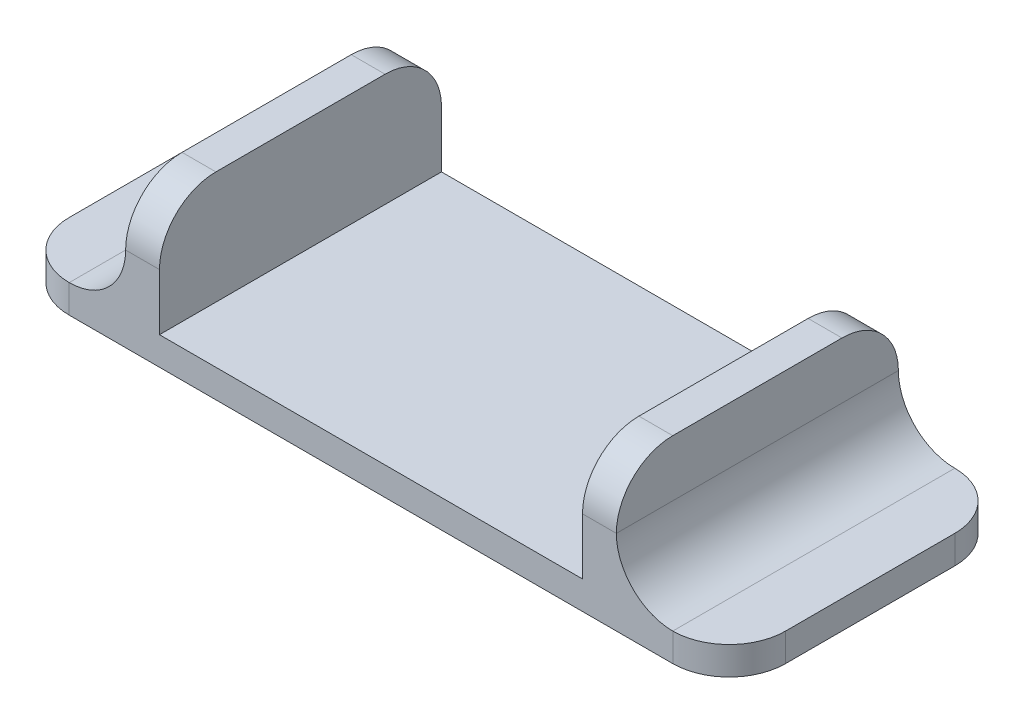
ISO-10303-21;
HEADER;
FILE_DESCRIPTION(('STEP AP214'),'2;1');
FILE_NAME('part.step','',(''),(''),'','','');
FILE_SCHEMA(('AUTOMOTIVE_DESIGN { 1 0 10303 214 1 1 1 1 }'));
ENDSEC;
DATA;
#1=APPLICATION_CONTEXT('core data for automotive mechanical design processes');
#2=APPLICATION_PROTOCOL_DEFINITION('international standard','automotive_design',2000,#1);
#3=PRODUCT_CONTEXT('',#1,'mechanical');
#4=PRODUCT('Part','Part','',(#3));
#5=PRODUCT_RELATED_PRODUCT_CATEGORY('part','',(#4));
#6=PRODUCT_DEFINITION_FORMATION('','',#4);
#7=PRODUCT_DEFINITION_CONTEXT('part definition',#1,'design');
#8=PRODUCT_DEFINITION('design','',#6,#7);
#9=PRODUCT_DEFINITION_SHAPE('','',#8);
#10=(LENGTH_UNIT() NAMED_UNIT(*) SI_UNIT(.MILLI.,.METRE.));
#11=(NAMED_UNIT(*) PLANE_ANGLE_UNIT() SI_UNIT($,.RADIAN.));
#12=(NAMED_UNIT(*) SI_UNIT($,.STERADIAN.) SOLID_ANGLE_UNIT());
#13=UNCERTAINTY_MEASURE_WITH_UNIT(LENGTH_MEASURE(1.E-05),#10,'distance_accuracy_value','');
#14=(GEOMETRIC_REPRESENTATION_CONTEXT(3) GLOBAL_UNCERTAINTY_ASSIGNED_CONTEXT((#13)) GLOBAL_UNIT_ASSIGNED_CONTEXT((#10,
#11,#12)) REPRESENTATION_CONTEXT('',''));
#15=CARTESIAN_POINT('',(0.,0.,0.));
#16=DIRECTION('',(0.,0.,1.));
#17=DIRECTION('',(1.,0.,0.));
#18=AXIS2_PLACEMENT_3D('',#15,#16,#17);
#19=CARTESIAN_POINT('',(0.,0.,50.));
#20=DIRECTION('',(0.,-1.,0.));
#21=DIRECTION('',(0.,0.,-1.));
#22=AXIS2_PLACEMENT_3D('',#19,#20,#21);
#23=PLANE('',#22);
#24=DIRECTION('',(-1.,0.,0.));
#25=VECTOR('',#24,1.);
#26=CARTESIAN_POINT('',(0.,0.,50.));
#27=LINE('',#26,#25);
#28=CARTESIAN_POINT('',(-1.,0.,50.));
#29=VERTEX_POINT('',#28);
#30=CARTESIAN_POINT('',(-76.,0.,50.));
#31=VERTEX_POINT('',#30);
#32=EDGE_CURVE('E284',#29,#31,#27,.T.);
#33=ORIENTED_EDGE('',*,*,#32,.F.);
#34=DIRECTION('',(0.,0.,1.));
#35=VECTOR('',#34,1.);
#36=CARTESIAN_POINT('',(-1.,0.,0.));
#37=LINE('',#36,#35);
#38=CARTESIAN_POINT('',(-1.,0.,0.));
#39=VERTEX_POINT('',#38);
#40=EDGE_CURVE('E306',#39,#29,#37,.T.);
#41=ORIENTED_EDGE('',*,*,#40,.F.);
#42=DIRECTION('',(-1.,0.,0.));
#43=VECTOR('',#42,1.);
#44=CARTESIAN_POINT('',(0.,0.,0.));
#45=LINE('',#44,#43);
#46=CARTESIAN_POINT('',(-76.,0.,0.));
#47=VERTEX_POINT('',#46);
#48=EDGE_CURVE('E286',#39,#47,#45,.T.);
#49=ORIENTED_EDGE('',*,*,#48,.T.);
#50=DIRECTION('',(0.,0.,-1.));
#51=VECTOR('',#50,1.);
#52=CARTESIAN_POINT('',(-76.,0.,50.));
#53=LINE('',#52,#51);
#54=EDGE_CURVE('E314',#31,#47,#53,.T.);
#55=ORIENTED_EDGE('',*,*,#54,.F.);
#56=EDGE_LOOP('',(#33,#41,#49,#55));
#57=FACE_BOUND('',#56,.T.);
#58=ADVANCED_FACE('F33',(#57),#23,.F.);
#59=CARTESIAN_POINT('',(-82.,40.,50.));
#60=DIRECTION('',(1.,0.,0.));
#61=DIRECTION('',(0.,0.,-1.));
#62=AXIS2_PLACEMENT_3D('',#59,#60,#61);
#63=PLANE('',#62);
#64=DIRECTION('',(0.,0.,1.));
#65=VECTOR('',#64,1.);
#66=CARTESIAN_POINT('',(-82.,20.,-43.));
#67=LINE('',#66,#65);
#68=CARTESIAN_POINT('',(-82.,20.,9.99999999999999));
#69=VERTEX_POINT('',#68);
#70=CARTESIAN_POINT('',(-82.,20.,40.));
#71=VERTEX_POINT('',#70);
#72=EDGE_CURVE('E294',#69,#71,#67,.T.);
#73=ORIENTED_EDGE('',*,*,#72,.F.);
#74=CARTESIAN_POINT('',(-82.,10.,10.));
#75=DIRECTION('',(1.,0.,0.));
#76=DIRECTION('',(0.,0.,-1.));
#77=AXIS2_PLACEMENT_3D('',#74,#75,#76);
#78=CIRCLE('',#77,10.);
#79=CARTESIAN_POINT('',(-82.,10.,0.));
#80=VERTEX_POINT('',#79);
#81=EDGE_CURVE('E274',#69,#80,#78,.F.);
#82=ORIENTED_EDGE('',*,*,#81,.T.);
#83=DIRECTION('',(0.,0.,-1.));
#84=VECTOR('',#83,1.);
#85=CARTESIAN_POINT('',(-82.,10.,50.));
#86=LINE('',#85,#84);
#87=CARTESIAN_POINT('',(-82.,10.,50.));
#88=VERTEX_POINT('',#87);
#89=EDGE_CURVE('E229',#80,#88,#86,.F.);
#90=ORIENTED_EDGE('',*,*,#89,.T.);
#91=CARTESIAN_POINT('',(-82.,10.,40.));
#92=DIRECTION('',(1.,0.,0.));
#93=DIRECTION('',(0.,0.,-1.));
#94=AXIS2_PLACEMENT_3D('',#91,#92,#93);
#95=CIRCLE('',#94,10.);
#96=EDGE_CURVE('E272',#88,#71,#95,.F.);
#97=ORIENTED_EDGE('',*,*,#96,.T.);
#98=EDGE_LOOP('',(#73,#82,#90,#97));
#99=FACE_BOUND('',#98,.T.);
#100=ADVANCED_FACE('F293',(#99),#63,.F.);
#101=CARTESIAN_POINT('',(-82.,0.,50.));
#102=DIRECTION('',(0.,-1.,0.));
#103=DIRECTION('',(0.,0.,-1.));
#104=AXIS2_PLACEMENT_3D('',#101,#102,#103);
#105=PLANE('',#104);
#106=DIRECTION('',(0.,0.,-1.));
#107=VECTOR('',#106,1.);
#108=CARTESIAN_POINT('',(-92.,0.,0.));
#109=LINE('',#108,#107);
#110=CARTESIAN_POINT('',(-92.,0.,50.));
#111=VERTEX_POINT('',#110);
#112=CARTESIAN_POINT('',(-92.,0.,0.));
#113=VERTEX_POINT('',#112);
#114=EDGE_CURVE('E218',#111,#113,#109,.T.);
#115=ORIENTED_EDGE('',*,*,#114,.T.);
#116=CARTESIAN_POINT('',(-92.,0.,10.));
#117=DIRECTION('',(0.,-1.,0.));
#118=DIRECTION('',(0.,0.,-1.));
#119=AXIS2_PLACEMENT_3D('',#116,#117,#118);
#120=CIRCLE('',#119,10.);
#121=CARTESIAN_POINT('',(-102.,0.,10.));
#122=VERTEX_POINT('',#121);
#123=EDGE_CURVE('E224',#113,#122,#120,.F.);
#124=ORIENTED_EDGE('',*,*,#123,.T.);
#125=DIRECTION('',(0.,0.,-1.));
#126=VECTOR('',#125,1.);
#127=CARTESIAN_POINT('',(-102.,0.,50.));
#128=LINE('',#127,#126);
#129=CARTESIAN_POINT('',(-102.,0.,40.));
#130=VERTEX_POINT('',#129);
#131=EDGE_CURVE('E186',#130,#122,#128,.T.);
#132=ORIENTED_EDGE('',*,*,#131,.F.);
#133=CARTESIAN_POINT('',(-92.,0.,40.));
#134=DIRECTION('',(0.,-1.,0.));
#135=DIRECTION('',(0.,0.,-1.));
#136=AXIS2_PLACEMENT_3D('',#133,#134,#135);
#137=CIRCLE('',#136,10.);
#138=EDGE_CURVE('E221',#130,#111,#137,.F.);
#139=ORIENTED_EDGE('',*,*,#138,.T.);
#140=EDGE_LOOP('',(#115,#124,#132,#139));
#141=FACE_BOUND('',#140,.T.);
#142=ADVANCED_FACE('F341',(#141),#105,.F.);
#143=CARTESIAN_POINT('',(-102.,-5.,50.));
#144=DIRECTION('',(1.,0.,0.));
#145=DIRECTION('',(0.,0.,-1.));
#146=AXIS2_PLACEMENT_3D('',#143,#144,#145);
#147=PLANE('',#146);
#148=ORIENTED_EDGE('',*,*,#131,.T.);
#149=DIRECTION('',(0.,-1.,0.));
#150=VECTOR('',#149,1.);
#151=CARTESIAN_POINT('',(-102.,-5.,10.));
#152=LINE('',#151,#150);
#153=CARTESIAN_POINT('',(-102.,-5.,10.));
#154=VERTEX_POINT('',#153);
#155=EDGE_CURVE('E215',#122,#154,#152,.T.);
#156=ORIENTED_EDGE('',*,*,#155,.T.);
#157=DIRECTION('',(0.,0.,-1.));
#158=VECTOR('',#157,1.);
#159=CARTESIAN_POINT('',(-102.,-5.,50.));
#160=LINE('',#159,#158);
#161=CARTESIAN_POINT('',(-102.,-5.,40.));
#162=VERTEX_POINT('',#161);
#163=EDGE_CURVE('E190',#162,#154,#160,.T.);
#164=ORIENTED_EDGE('',*,*,#163,.F.);
#165=DIRECTION('',(0.,-1.,0.));
#166=VECTOR('',#165,1.);
#167=CARTESIAN_POINT('',(-102.,-5.,40.));
#168=LINE('',#167,#166);
#169=EDGE_CURVE('E213',#162,#130,#168,.F.);
#170=ORIENTED_EDGE('',*,*,#169,.T.);
#171=EDGE_LOOP('',(#148,#156,#164,#170));
#172=FACE_BOUND('',#171,.T.);
#173=ADVANCED_FACE('F332',(#172),#147,.F.);
#174=CARTESIAN_POINT('',(25.,-5.,50.));
#175=DIRECTION('',(0.,1.,0.));
#176=DIRECTION('',(0.,0.,1.));
#177=AXIS2_PLACEMENT_3D('',#174,#175,#176);
#178=PLANE('',#177);
#179=DIRECTION('',(1.,0.,0.));
#180=VECTOR('',#179,1.);
#181=CARTESIAN_POINT('',(25.,-5.,0.));
#182=LINE('',#181,#180);
#183=CARTESIAN_POINT('',(-92.,-5.,0.));
#184=VERTEX_POINT('',#183);
#185=CARTESIAN_POINT('',(15.,-5.,0.));
#186=VERTEX_POINT('',#185);
#187=EDGE_CURVE('E318',#184,#186,#182,.T.);
#188=ORIENTED_EDGE('',*,*,#187,.T.);
#189=CARTESIAN_POINT('',(15.,-5.,10.));
#190=DIRECTION('',(0.,1.,0.));
#191=DIRECTION('',(0.,0.,1.));
#192=AXIS2_PLACEMENT_3D('',#189,#190,#191);
#193=CIRCLE('',#192,10.);
#194=CARTESIAN_POINT('',(25.,-5.,10.));
#195=VERTEX_POINT('',#194);
#196=EDGE_CURVE('E206',#186,#195,#193,.F.);
#197=ORIENTED_EDGE('',*,*,#196,.T.);
#198=DIRECTION('',(0.,0.,-1.));
#199=VECTOR('',#198,1.);
#200=CARTESIAN_POINT('',(25.,-5.,50.));
#201=LINE('',#200,#199);
#202=CARTESIAN_POINT('',(25.,-5.,40.));
#203=VERTEX_POINT('',#202);
#204=EDGE_CURVE('E180',#203,#195,#201,.T.);
#205=ORIENTED_EDGE('',*,*,#204,.F.);
#206=CARTESIAN_POINT('',(15.,-5.,40.));
#207=DIRECTION('',(0.,1.,0.));
#208=DIRECTION('',(0.,0.,1.));
#209=AXIS2_PLACEMENT_3D('',#206,#207,#208);
#210=CIRCLE('',#209,10.);
#211=CARTESIAN_POINT('',(15.,-5.,50.));
#212=VERTEX_POINT('',#211);
#213=EDGE_CURVE('E185',#203,#212,#210,.F.);
#214=ORIENTED_EDGE('',*,*,#213,.T.);
#215=DIRECTION('',(1.,0.,0.));
#216=VECTOR('',#215,1.);
#217=CARTESIAN_POINT('',(25.,-5.,50.));
#218=LINE('',#217,#216);
#219=CARTESIAN_POINT('',(-92.,-5.,50.));
#220=VERTEX_POINT('',#219);
#221=EDGE_CURVE('E181',#220,#212,#218,.T.);
#222=ORIENTED_EDGE('',*,*,#221,.F.);
#223=CARTESIAN_POINT('',(-92.,-5.,40.));
#224=DIRECTION('',(0.,1.,0.));
#225=DIRECTION('',(0.,0.,1.));
#226=AXIS2_PLACEMENT_3D('',#223,#224,#225);
#227=CIRCLE('',#226,10.);
#228=EDGE_CURVE('E201',#220,#162,#227,.F.);
#229=ORIENTED_EDGE('',*,*,#228,.T.);
#230=ORIENTED_EDGE('',*,*,#163,.T.);
#231=CARTESIAN_POINT('',(-92.,-5.,10.));
#232=DIRECTION('',(0.,1.,0.));
#233=DIRECTION('',(0.,0.,1.));
#234=AXIS2_PLACEMENT_3D('',#231,#232,#233);
#235=CIRCLE('',#234,10.);
#236=EDGE_CURVE('E203',#154,#184,#235,.F.);
#237=ORIENTED_EDGE('',*,*,#236,.T.);
#238=EDGE_LOOP('',(#188,#197,#205,#214,#222,#229,#230,#237));
#239=FACE_BOUND('',#238,.T.);
#240=ADVANCED_FACE('F327',(#239),#178,.F.);
#241=CARTESIAN_POINT('',(25.,0.,50.));
#242=DIRECTION('',(-1.,0.,0.));
#243=DIRECTION('',(0.,0.,1.));
#244=AXIS2_PLACEMENT_3D('',#241,#242,#243);
#245=PLANE('',#244);
#246=ORIENTED_EDGE('',*,*,#204,.T.);
#247=DIRECTION('',(0.,1.,0.));
#248=VECTOR('',#247,1.);
#249=CARTESIAN_POINT('',(25.,0.,10.));
#250=LINE('',#249,#248);
#251=CARTESIAN_POINT('',(25.,0.,10.));
#252=VERTEX_POINT('',#251);
#253=EDGE_CURVE('E179',#195,#252,#250,.T.);
#254=ORIENTED_EDGE('',*,*,#253,.T.);
#255=DIRECTION('',(0.,0.,-1.));
#256=VECTOR('',#255,1.);
#257=CARTESIAN_POINT('',(25.,0.,50.));
#258=LINE('',#257,#256);
#259=CARTESIAN_POINT('',(25.,0.,40.));
#260=VERTEX_POINT('',#259);
#261=EDGE_CURVE('E162',#260,#252,#258,.T.);
#262=ORIENTED_EDGE('',*,*,#261,.F.);
#263=DIRECTION('',(0.,1.,0.));
#264=VECTOR('',#263,1.);
#265=CARTESIAN_POINT('',(25.,0.,40.));
#266=LINE('',#265,#264);
#267=EDGE_CURVE('E176',#260,#203,#266,.F.);
#268=ORIENTED_EDGE('',*,*,#267,.T.);
#269=EDGE_LOOP('',(#246,#254,#262,#268));
#270=FACE_BOUND('',#269,.T.);
#271=ADVANCED_FACE('F175',(#270),#245,.F.);
#272=CARTESIAN_POINT('',(5.,0.,50.));
#273=DIRECTION('',(0.,-1.,0.));
#274=DIRECTION('',(0.,0.,-1.));
#275=AXIS2_PLACEMENT_3D('',#272,#273,#274);
#276=PLANE('',#275);
#277=ORIENTED_EDGE('',*,*,#261,.T.);
#278=CARTESIAN_POINT('',(15.,0.,10.));
#279=DIRECTION('',(0.,-1.,0.));
#280=DIRECTION('',(0.,0.,-1.));
#281=AXIS2_PLACEMENT_3D('',#278,#279,#280);
#282=CIRCLE('',#281,10.);
#283=CARTESIAN_POINT('',(15.,0.,0.));
#284=VERTEX_POINT('',#283);
#285=EDGE_CURVE('E170',#252,#284,#282,.F.);
#286=ORIENTED_EDGE('',*,*,#285,.T.);
#287=DIRECTION('',(0.,0.,-1.));
#288=VECTOR('',#287,1.);
#289=CARTESIAN_POINT('',(15.,0.,50.));
#290=LINE('',#289,#288);
#291=CARTESIAN_POINT('',(15.,0.,50.));
#292=VERTEX_POINT('',#291);
#293=EDGE_CURVE('E164',#284,#292,#290,.F.);
#294=ORIENTED_EDGE('',*,*,#293,.T.);
#295=CARTESIAN_POINT('',(15.,0.,40.));
#296=DIRECTION('',(0.,-1.,0.));
#297=DIRECTION('',(0.,0.,-1.));
#298=AXIS2_PLACEMENT_3D('',#295,#296,#297);
#299=CIRCLE('',#298,10.);
#300=EDGE_CURVE('E158',#292,#260,#299,.F.);
#301=ORIENTED_EDGE('',*,*,#300,.T.);
#302=EDGE_LOOP('',(#277,#286,#294,#301));
#303=FACE_BOUND('',#302,.T.);
#304=ADVANCED_FACE('F160',(#303),#276,.F.);
#305=CARTESIAN_POINT('',(5.,40.,50.));
#306=DIRECTION('',(-1.,0.,0.));
#307=DIRECTION('',(0.,0.,1.));
#308=AXIS2_PLACEMENT_3D('',#305,#306,#307);
#309=PLANE('',#308);
#310=DIRECTION('',(0.,0.,1.));
#311=VECTOR('',#310,1.);
#312=CARTESIAN_POINT('',(5.,20.,-43.));
#313=LINE('',#312,#311);
#314=CARTESIAN_POINT('',(5.,20.,9.99999999999999));
#315=VERTEX_POINT('',#314);
#316=CARTESIAN_POINT('',(5.,20.,40.));
#317=VERTEX_POINT('',#316);
#318=EDGE_CURVE('E300',#315,#317,#313,.T.);
#319=ORIENTED_EDGE('',*,*,#318,.T.);
#320=CARTESIAN_POINT('',(5.,10.,40.));
#321=DIRECTION('',(-1.,0.,0.));
#322=DIRECTION('',(0.,0.,1.));
#323=AXIS2_PLACEMENT_3D('',#320,#321,#322);
#324=CIRCLE('',#323,10.);
#325=CARTESIAN_POINT('',(5.,10.,50.));
#326=VERTEX_POINT('',#325);
#327=EDGE_CURVE('E253',#317,#326,#324,.F.);
#328=ORIENTED_EDGE('',*,*,#327,.T.);
#329=DIRECTION('',(0.,0.,-1.));
#330=VECTOR('',#329,1.);
#331=CARTESIAN_POINT('',(5.,10.,0.));
#332=LINE('',#331,#330);
#333=CARTESIAN_POINT('',(5.,10.,0.));
#334=VERTEX_POINT('',#333);
#335=EDGE_CURVE('E226',#326,#334,#332,.T.);
#336=ORIENTED_EDGE('',*,*,#335,.T.);
#337=CARTESIAN_POINT('',(5.,10.,10.));
#338=DIRECTION('',(-1.,0.,0.));
#339=DIRECTION('',(0.,0.,1.));
#340=AXIS2_PLACEMENT_3D('',#337,#338,#339);
#341=CIRCLE('',#340,10.);
#342=EDGE_CURVE('E251',#334,#315,#341,.F.);
#343=ORIENTED_EDGE('',*,*,#342,.T.);
#344=EDGE_LOOP('',(#319,#328,#336,#343));
#345=FACE_BOUND('',#344,.T.);
#346=ADVANCED_FACE('F375',(#345),#309,.F.);
#347=CARTESIAN_POINT('',(0.,0.,50.));
#348=DIRECTION('',(0.,0.,-1.));
#349=DIRECTION('',(-1.,0.,0.));
#350=AXIS2_PLACEMENT_3D('',#347,#348,#349);
#351=PLANE('',#350);
#352=CARTESIAN_POINT('',(15.,10.,50.));
#353=DIRECTION('',(0.,0.,-1.));
#354=DIRECTION('',(-1.,0.,0.));
#355=AXIS2_PLACEMENT_3D('',#352,#353,#354);
#356=CIRCLE('',#355,10.);
#357=EDGE_CURVE('E239',#292,#326,#356,.T.);
#358=ORIENTED_EDGE('',*,*,#357,.T.);
#359=DIRECTION('',(1.,0.,0.));
#360=VECTOR('',#359,1.);
#361=CARTESIAN_POINT('',(0.,10.,50.));
#362=LINE('',#361,#360);
#363=CARTESIAN_POINT('',(-1.,10.,50.));
#364=VERTEX_POINT('',#363);
#365=EDGE_CURVE('E257',#326,#364,#362,.F.);
#366=ORIENTED_EDGE('',*,*,#365,.T.);
#367=DIRECTION('',(0.,1.,0.));
#368=VECTOR('',#367,1.);
#369=CARTESIAN_POINT('',(-1.,0.,50.));
#370=LINE('',#369,#368);
#371=EDGE_CURVE('E309',#29,#364,#370,.T.);
#372=ORIENTED_EDGE('',*,*,#371,.F.);
#373=ORIENTED_EDGE('',*,*,#32,.T.);
#374=DIRECTION('',(0.,-1.,0.));
#375=VECTOR('',#374,1.);
#376=CARTESIAN_POINT('',(-76.,30.,50.));
#377=LINE('',#376,#375);
#378=CARTESIAN_POINT('',(-76.,10.,50.));
#379=VERTEX_POINT('',#378);
#380=EDGE_CURVE('E278',#379,#31,#377,.T.);
#381=ORIENTED_EDGE('',*,*,#380,.F.);
#382=DIRECTION('',(1.,0.,0.));
#383=VECTOR('',#382,1.);
#384=CARTESIAN_POINT('',(0.,10.,50.));
#385=LINE('',#384,#383);
#386=EDGE_CURVE('E255',#379,#88,#385,.F.);
#387=ORIENTED_EDGE('',*,*,#386,.T.);
#388=CARTESIAN_POINT('',(-92.,10.,50.));
#389=DIRECTION('',(0.,0.,-1.));
#390=DIRECTION('',(-1.,0.,0.));
#391=AXIS2_PLACEMENT_3D('',#388,#389,#390);
#392=CIRCLE('',#391,10.);
#393=EDGE_CURVE('E235',#88,#111,#392,.T.);
#394=ORIENTED_EDGE('',*,*,#393,.T.);
#395=DIRECTION('',(0.,-1.,0.));
#396=VECTOR('',#395,1.);
#397=CARTESIAN_POINT('',(-92.,0.,50.));
#398=LINE('',#397,#396);
#399=EDGE_CURVE('E208',#111,#220,#398,.T.);
#400=ORIENTED_EDGE('',*,*,#399,.T.);
#401=ORIENTED_EDGE('',*,*,#221,.T.);
#402=DIRECTION('',(0.,1.,0.));
#403=VECTOR('',#402,1.);
#404=CARTESIAN_POINT('',(15.,0.,50.));
#405=LINE('',#404,#403);
#406=EDGE_CURVE('E211',#212,#292,#405,.T.);
#407=ORIENTED_EDGE('',*,*,#406,.T.);
#408=EDGE_LOOP('',(#358,#366,#372,#373,#381,#387,#394,#400,#401,#407));
#409=FACE_BOUND('',#408,.T.);
#410=ADVANCED_FACE('F282',(#409),#351,.F.);
#411=CARTESIAN_POINT('',(0.,0.,0.));
#412=DIRECTION('',(0.,0.,-1.));
#413=DIRECTION('',(-1.,0.,0.));
#414=AXIS2_PLACEMENT_3D('',#411,#412,#413);
#415=PLANE('',#414);
#416=DIRECTION('',(0.,-1.,0.));
#417=VECTOR('',#416,1.);
#418=CARTESIAN_POINT('',(-1.,30.,0.));
#419=LINE('',#418,#417);
#420=CARTESIAN_POINT('',(-1.,10.,0.));
#421=VERTEX_POINT('',#420);
#422=EDGE_CURVE('E312',#421,#39,#419,.T.);
#423=ORIENTED_EDGE('',*,*,#422,.F.);
#424=DIRECTION('',(-1.,0.,0.));
#425=VECTOR('',#424,1.);
#426=CARTESIAN_POINT('',(5.,10.,0.));
#427=LINE('',#426,#425);
#428=EDGE_CURVE('E265',#421,#334,#427,.F.);
#429=ORIENTED_EDGE('',*,*,#428,.T.);
#430=CARTESIAN_POINT('',(15.,10.,0.));
#431=DIRECTION('',(0.,0.,-1.));
#432=DIRECTION('',(-1.,0.,0.));
#433=AXIS2_PLACEMENT_3D('',#430,#431,#432);
#434=CIRCLE('',#433,10.);
#435=EDGE_CURVE('E237',#334,#284,#434,.F.);
#436=ORIENTED_EDGE('',*,*,#435,.T.);
#437=DIRECTION('',(0.,1.,0.));
#438=VECTOR('',#437,1.);
#439=CARTESIAN_POINT('',(15.,-5.,0.));
#440=LINE('',#439,#438);
#441=EDGE_CURVE('E199',#284,#186,#440,.F.);
#442=ORIENTED_EDGE('',*,*,#441,.T.);
#443=ORIENTED_EDGE('',*,*,#187,.F.);
#444=DIRECTION('',(0.,-1.,0.));
#445=VECTOR('',#444,1.);
#446=CARTESIAN_POINT('',(-92.,0.,0.));
#447=LINE('',#446,#445);
#448=EDGE_CURVE('E196',#184,#113,#447,.F.);
#449=ORIENTED_EDGE('',*,*,#448,.T.);
#450=CARTESIAN_POINT('',(-92.,10.,0.));
#451=DIRECTION('',(0.,0.,-1.));
#452=DIRECTION('',(-1.,0.,0.));
#453=AXIS2_PLACEMENT_3D('',#450,#451,#452);
#454=CIRCLE('',#453,10.);
#455=EDGE_CURVE('E232',#113,#80,#454,.F.);
#456=ORIENTED_EDGE('',*,*,#455,.T.);
#457=DIRECTION('',(-1.,0.,0.));
#458=VECTOR('',#457,1.);
#459=CARTESIAN_POINT('',(-76.,10.,0.));
#460=LINE('',#459,#458);
#461=CARTESIAN_POINT('',(-76.,10.,0.));
#462=VERTEX_POINT('',#461);
#463=EDGE_CURVE('E263',#80,#462,#460,.F.);
#464=ORIENTED_EDGE('',*,*,#463,.T.);
#465=DIRECTION('',(0.,1.,0.));
#466=VECTOR('',#465,1.);
#467=CARTESIAN_POINT('',(-76.,0.,0.));
#468=LINE('',#467,#466);
#469=EDGE_CURVE('E287',#47,#462,#468,.T.);
#470=ORIENTED_EDGE('',*,*,#469,.F.);
#471=ORIENTED_EDGE('',*,*,#48,.F.);
#472=EDGE_LOOP('',(#423,#429,#436,#442,#443,#449,#456,#464,#470,#471));
#473=FACE_BOUND('',#472,.T.);
#474=ADVANCED_FACE('F348',(#473),#415,.T.);
#475=CARTESIAN_POINT('',(15.,0.,10.));
#476=DIRECTION('',(0.,-1.,0.));
#477=DIRECTION('',(0.,0.,-1.));
#478=AXIS2_PLACEMENT_3D('',#475,#476,#477);
#479=CYLINDRICAL_SURFACE('',#478,10.);
#480=ORIENTED_EDGE('',*,*,#196,.F.);
#481=ORIENTED_EDGE('',*,*,#441,.F.);
#482=ORIENTED_EDGE('',*,*,#285,.F.);
#483=ORIENTED_EDGE('',*,*,#253,.F.);
#484=EDGE_LOOP('',(#480,#481,#482,#483));
#485=FACE_BOUND('',#484,.T.);
#486=ADVANCED_FACE('F352',(#485),#479,.T.);
#487=CARTESIAN_POINT('',(15.,0.,40.));
#488=DIRECTION('',(0.,1.,0.));
#489=DIRECTION('',(0.,0.,1.));
#490=AXIS2_PLACEMENT_3D('',#487,#488,#489);
#491=CYLINDRICAL_SURFACE('',#490,10.);
#492=ORIENTED_EDGE('',*,*,#213,.F.);
#493=ORIENTED_EDGE('',*,*,#267,.F.);
#494=ORIENTED_EDGE('',*,*,#300,.F.);
#495=ORIENTED_EDGE('',*,*,#406,.F.);
#496=EDGE_LOOP('',(#492,#493,#494,#495));
#497=FACE_BOUND('',#496,.T.);
#498=ADVANCED_FACE('F184',(#497),#491,.T.);
#499=CARTESIAN_POINT('',(-92.,-5.,10.));
#500=DIRECTION('',(0.,1.,0.));
#501=DIRECTION('',(0.,0.,1.));
#502=AXIS2_PLACEMENT_3D('',#499,#500,#501);
#503=CYLINDRICAL_SURFACE('',#502,10.);
#504=ORIENTED_EDGE('',*,*,#123,.F.);
#505=ORIENTED_EDGE('',*,*,#448,.F.);
#506=ORIENTED_EDGE('',*,*,#236,.F.);
#507=ORIENTED_EDGE('',*,*,#155,.F.);
#508=EDGE_LOOP('',(#504,#505,#506,#507));
#509=FACE_BOUND('',#508,.T.);
#510=ADVANCED_FACE('F344',(#509),#503,.T.);
#511=CARTESIAN_POINT('',(-92.,0.,40.));
#512=DIRECTION('',(0.,-1.,0.));
#513=DIRECTION('',(0.,0.,-1.));
#514=AXIS2_PLACEMENT_3D('',#511,#512,#513);
#515=CYLINDRICAL_SURFACE('',#514,10.);
#516=ORIENTED_EDGE('',*,*,#138,.F.);
#517=ORIENTED_EDGE('',*,*,#169,.F.);
#518=ORIENTED_EDGE('',*,*,#228,.F.);
#519=ORIENTED_EDGE('',*,*,#399,.F.);
#520=EDGE_LOOP('',(#516,#517,#518,#519));
#521=FACE_BOUND('',#520,.T.);
#522=ADVANCED_FACE('F337',(#521),#515,.T.);
#523=CARTESIAN_POINT('',(-92.,10.,50.));
#524=DIRECTION('',(0.,0.,1.));
#525=DIRECTION('',(1.,0.,0.));
#526=AXIS2_PLACEMENT_3D('',#523,#524,#525);
#527=CYLINDRICAL_SURFACE('',#526,10.);
#528=ORIENTED_EDGE('',*,*,#393,.F.);
#529=ORIENTED_EDGE('',*,*,#89,.F.);
#530=ORIENTED_EDGE('',*,*,#455,.F.);
#531=ORIENTED_EDGE('',*,*,#114,.F.);
#532=EDGE_LOOP('',(#528,#529,#530,#531));
#533=FACE_BOUND('',#532,.T.);
#534=ADVANCED_FACE('F359',(#533),#527,.F.);
#535=CARTESIAN_POINT('',(15.,10.,50.));
#536=DIRECTION('',(0.,0.,1.));
#537=DIRECTION('',(1.,0.,0.));
#538=AXIS2_PLACEMENT_3D('',#535,#536,#537);
#539=CYLINDRICAL_SURFACE('',#538,10.);
#540=ORIENTED_EDGE('',*,*,#357,.F.);
#541=ORIENTED_EDGE('',*,*,#293,.F.);
#542=ORIENTED_EDGE('',*,*,#435,.F.);
#543=ORIENTED_EDGE('',*,*,#335,.F.);
#544=EDGE_LOOP('',(#540,#541,#542,#543));
#545=FACE_BOUND('',#544,.T.);
#546=ADVANCED_FACE('F355',(#545),#539,.F.);
#547=CARTESIAN_POINT('',(-76.,30.,10.));
#548=DIRECTION('',(1.,0.,0.));
#549=DIRECTION('',(0.,0.,-1.));
#550=AXIS2_PLACEMENT_3D('',#547,#548,#549);
#551=PLANE('',#550);
#552=ORIENTED_EDGE('',*,*,#469,.T.);
#553=CARTESIAN_POINT('',(-76.,10.,10.));
#554=DIRECTION('',(1.,0.,0.));
#555=DIRECTION('',(0.,0.,-1.));
#556=AXIS2_PLACEMENT_3D('',#553,#554,#555);
#557=CIRCLE('',#556,10.);
#558=CARTESIAN_POINT('',(-76.,20.,10.));
#559=VERTEX_POINT('',#558);
#560=EDGE_CURVE('E11',#462,#559,#557,.T.);
#561=ORIENTED_EDGE('',*,*,#560,.T.);
#562=DIRECTION('',(0.,0.,-1.));
#563=VECTOR('',#562,1.);
#564=CARTESIAN_POINT('',(-76.,20.,10.));
#565=LINE('',#564,#563);
#566=CARTESIAN_POINT('',(-76.,20.,40.));
#567=VERTEX_POINT('',#566);
#568=EDGE_CURVE('E280',#567,#559,#565,.T.);
#569=ORIENTED_EDGE('',*,*,#568,.F.);
#570=CARTESIAN_POINT('',(-76.,10.,40.));
#571=DIRECTION('',(1.,0.,0.));
#572=DIRECTION('',(0.,0.,-1.));
#573=AXIS2_PLACEMENT_3D('',#570,#571,#572);
#574=CIRCLE('',#573,10.);
#575=EDGE_CURVE('E41',#567,#379,#574,.T.);
#576=ORIENTED_EDGE('',*,*,#575,.T.);
#577=ORIENTED_EDGE('',*,*,#380,.T.);
#578=ORIENTED_EDGE('',*,*,#54,.T.);
#579=EDGE_LOOP('',(#552,#561,#569,#576,#577,#578));
#580=FACE_BOUND('',#579,.T.);
#581=ADVANCED_FACE('F276',(#580),#551,.T.);
#582=CARTESIAN_POINT('',(-1.,30.,40.));
#583=DIRECTION('',(-1.,0.,0.));
#584=DIRECTION('',(0.,0.,1.));
#585=AXIS2_PLACEMENT_3D('',#582,#583,#584);
#586=PLANE('',#585);
#587=ORIENTED_EDGE('',*,*,#371,.T.);
#588=CARTESIAN_POINT('',(-1.,10.,40.));
#589=DIRECTION('',(-1.,0.,0.));
#590=DIRECTION('',(0.,0.,1.));
#591=AXIS2_PLACEMENT_3D('',#588,#589,#590);
#592=CIRCLE('',#591,10.);
#593=CARTESIAN_POINT('',(-1.,20.,40.));
#594=VERTEX_POINT('',#593);
#595=EDGE_CURVE('E261',#364,#594,#592,.T.);
#596=ORIENTED_EDGE('',*,*,#595,.T.);
#597=DIRECTION('',(0.,0.,1.));
#598=VECTOR('',#597,1.);
#599=CARTESIAN_POINT('',(-1.,20.,40.));
#600=LINE('',#599,#598);
#601=CARTESIAN_POINT('',(-1.,20.,10.));
#602=VERTEX_POINT('',#601);
#603=EDGE_CURVE('E242',#602,#594,#600,.T.);
#604=ORIENTED_EDGE('',*,*,#603,.F.);
#605=CARTESIAN_POINT('',(-1.,10.,10.));
#606=DIRECTION('',(-1.,0.,0.));
#607=DIRECTION('',(0.,0.,1.));
#608=AXIS2_PLACEMENT_3D('',#605,#606,#607);
#609=CIRCLE('',#608,10.);
#610=EDGE_CURVE('E259',#602,#421,#609,.T.);
#611=ORIENTED_EDGE('',*,*,#610,.T.);
#612=ORIENTED_EDGE('',*,*,#422,.T.);
#613=ORIENTED_EDGE('',*,*,#40,.T.);
#614=EDGE_LOOP('',(#587,#596,#604,#611,#612,#613));
#615=FACE_BOUND('',#614,.T.);
#616=ADVANCED_FACE('F383',(#615),#586,.T.);
#617=CARTESIAN_POINT('',(-82.,20.,-43.));
#618=DIRECTION('',(0.,-1.,0.));
#619=DIRECTION('',(0.,0.,-1.));
#620=AXIS2_PLACEMENT_3D('',#617,#618,#619);
#621=PLANE('',#620);
#622=ORIENTED_EDGE('',*,*,#603,.T.);
#623=DIRECTION('',(1.,0.,0.));
#624=VECTOR('',#623,1.);
#625=CARTESIAN_POINT('',(-82.,20.,40.));
#626=LINE('',#625,#624);
#627=EDGE_CURVE('E248',#594,#317,#626,.T.);
#628=ORIENTED_EDGE('',*,*,#627,.T.);
#629=ORIENTED_EDGE('',*,*,#318,.F.);
#630=DIRECTION('',(-1.,0.,0.));
#631=VECTOR('',#630,1.);
#632=CARTESIAN_POINT('',(-1.,20.,10.));
#633=LINE('',#632,#631);
#634=EDGE_CURVE('E245',#315,#602,#633,.T.);
#635=ORIENTED_EDGE('',*,*,#634,.T.);
#636=EDGE_LOOP('',(#622,#628,#629,#635));
#637=FACE_BOUND('',#636,.T.);
#638=ADVANCED_FACE('F377',(#637),#621,.F.);
#639=ORIENTED_EDGE('',*,*,#568,.T.);
#640=DIRECTION('',(-1.,0.,0.));
#641=VECTOR('',#640,1.);
#642=CARTESIAN_POINT('',(-82.,20.,10.));
#643=LINE('',#642,#641);
#644=EDGE_CURVE('E269',#559,#69,#643,.T.);
#645=ORIENTED_EDGE('',*,*,#644,.T.);
#646=ORIENTED_EDGE('',*,*,#72,.T.);
#647=DIRECTION('',(1.,0.,0.));
#648=VECTOR('',#647,1.);
#649=CARTESIAN_POINT('',(-82.,20.,40.));
#650=LINE('',#649,#648);
#651=EDGE_CURVE('E267',#71,#567,#650,.T.);
#652=ORIENTED_EDGE('',*,*,#651,.T.);
#653=EDGE_LOOP('',(#639,#645,#646,#652));
#654=FACE_BOUND('',#653,.T.);
#655=ADVANCED_FACE('F298',(#654),#621,.F.);
#656=CARTESIAN_POINT('',(-82.,10.,40.));
#657=DIRECTION('',(1.,0.,0.));
#658=DIRECTION('',(0.,0.,-1.));
#659=AXIS2_PLACEMENT_3D('',#656,#657,#658);
#660=CYLINDRICAL_SURFACE('',#659,10.);
#661=ORIENTED_EDGE('',*,*,#595,.F.);
#662=ORIENTED_EDGE('',*,*,#365,.F.);
#663=ORIENTED_EDGE('',*,*,#327,.F.);
#664=ORIENTED_EDGE('',*,*,#627,.F.);
#665=EDGE_LOOP('',(#661,#662,#663,#664));
#666=FACE_BOUND('',#665,.T.);
#667=ADVANCED_FACE('F382',(#666),#660,.T.);
#668=CARTESIAN_POINT('',(-82.,10.,10.));
#669=DIRECTION('',(1.,0.,0.));
#670=DIRECTION('',(0.,0.,-1.));
#671=AXIS2_PLACEMENT_3D('',#668,#669,#670);
#672=CYLINDRICAL_SURFACE('',#671,10.);
#673=ORIENTED_EDGE('',*,*,#342,.F.);
#674=ORIENTED_EDGE('',*,*,#428,.F.);
#675=ORIENTED_EDGE('',*,*,#610,.F.);
#676=ORIENTED_EDGE('',*,*,#634,.F.);
#677=EDGE_LOOP('',(#673,#674,#675,#676));
#678=FACE_BOUND('',#677,.T.);
#679=ADVANCED_FACE('F371',(#678),#672,.T.);
#680=CARTESIAN_POINT('',(-82.,10.,10.));
#681=DIRECTION('',(1.,0.,0.));
#682=DIRECTION('',(0.,0.,-1.));
#683=AXIS2_PLACEMENT_3D('',#680,#681,#682);
#684=CYLINDRICAL_SURFACE('',#683,10.);
#685=ORIENTED_EDGE('',*,*,#560,.F.);
#686=ORIENTED_EDGE('',*,*,#463,.F.);
#687=ORIENTED_EDGE('',*,*,#81,.F.);
#688=ORIENTED_EDGE('',*,*,#644,.F.);
#689=EDGE_LOOP('',(#685,#686,#687,#688));
#690=FACE_BOUND('',#689,.T.);
#691=ADVANCED_FACE('F362',(#690),#684,.T.);
#692=CARTESIAN_POINT('',(-82.,10.,40.));
#693=DIRECTION('',(1.,0.,0.));
#694=DIRECTION('',(0.,0.,-1.));
#695=AXIS2_PLACEMENT_3D('',#692,#693,#694);
#696=CYLINDRICAL_SURFACE('',#695,10.);
#697=ORIENTED_EDGE('',*,*,#96,.F.);
#698=ORIENTED_EDGE('',*,*,#386,.F.);
#699=ORIENTED_EDGE('',*,*,#575,.F.);
#700=ORIENTED_EDGE('',*,*,#651,.F.);
#701=EDGE_LOOP('',(#697,#698,#699,#700));
#702=FACE_BOUND('',#701,.T.);
#703=ADVANCED_FACE('F35',(#702),#696,.T.);
#704=CLOSED_SHELL('',(#58,#100,#142,#173,#240,#271,#304,#346,#410,#474,#486,#498,#510,#522,#534,
#546,#581,#616,#638,#655,#667,#679,#691,#703));
#705=MANIFOLD_SOLID_BREP('B2',#704);
#706=ADVANCED_BREP_SHAPE_REPRESENTATION('',(#18,#705),#14);
#707=SHAPE_DEFINITION_REPRESENTATION(#9,#706);
ENDSEC;
END-ISO-10303-21;
